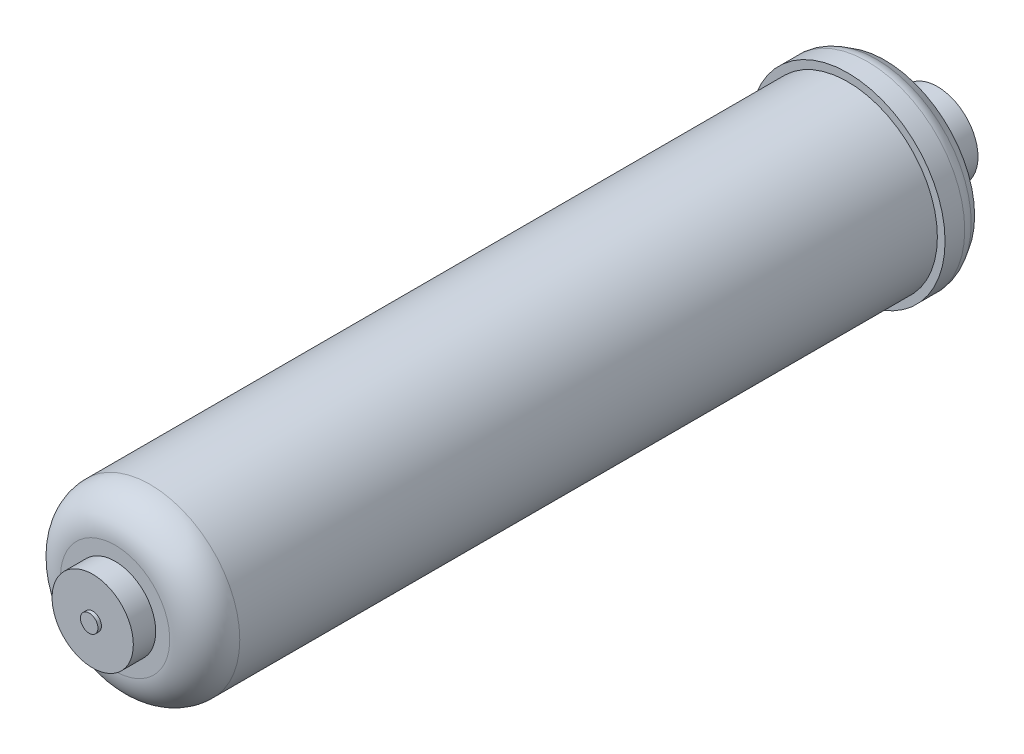
ISO-10303-21;
HEADER;
FILE_DESCRIPTION(('STEP AP214'),'2;1');
FILE_NAME('part.step','',(''),(''),'','','');
FILE_SCHEMA(('AUTOMOTIVE_DESIGN { 1 0 10303 214 1 1 1 1 }'));
ENDSEC;
DATA;
#1=APPLICATION_CONTEXT('core data for automotive mechanical design processes');
#2=APPLICATION_PROTOCOL_DEFINITION('international standard','automotive_design',2000,#1);
#3=PRODUCT_CONTEXT('',#1,'mechanical');
#4=PRODUCT('Part','Part','',(#3));
#5=PRODUCT_RELATED_PRODUCT_CATEGORY('part','',(#4));
#6=PRODUCT_DEFINITION_FORMATION('','',#4);
#7=PRODUCT_DEFINITION_CONTEXT('part definition',#1,'design');
#8=PRODUCT_DEFINITION('design','',#6,#7);
#9=PRODUCT_DEFINITION_SHAPE('','',#8);
#10=(LENGTH_UNIT() NAMED_UNIT(*) SI_UNIT(.MILLI.,.METRE.));
#11=(NAMED_UNIT(*) PLANE_ANGLE_UNIT() SI_UNIT($,.RADIAN.));
#12=(NAMED_UNIT(*) SI_UNIT($,.STERADIAN.) SOLID_ANGLE_UNIT());
#13=UNCERTAINTY_MEASURE_WITH_UNIT(LENGTH_MEASURE(1.E-05),#10,'distance_accuracy_value','');
#14=(GEOMETRIC_REPRESENTATION_CONTEXT(3) GLOBAL_UNCERTAINTY_ASSIGNED_CONTEXT((#13)) GLOBAL_UNIT_ASSIGNED_CONTEXT((#10,
#11,#12)) REPRESENTATION_CONTEXT('',''));
#15=CARTESIAN_POINT('',(0.,0.,0.));
#16=DIRECTION('',(0.,0.,1.));
#17=DIRECTION('',(1.,0.,0.));
#18=AXIS2_PLACEMENT_3D('',#15,#16,#17);
#19=CARTESIAN_POINT('',(0.,0.,0.));
#20=DIRECTION('',(0.,0.,-1.));
#21=DIRECTION('',(-1.,0.,0.));
#22=AXIS2_PLACEMENT_3D('',#19,#20,#21);
#23=PLANE('',#22);
#24=CARTESIAN_POINT('',(0.,0.,0.));
#25=DIRECTION('',(0.,0.,1.));
#26=DIRECTION('',(1.,0.,0.));
#27=AXIS2_PLACEMENT_3D('',#24,#25,#26);
#28=CIRCLE('',#27,3.175);
#29=CARTESIAN_POINT('',(3.175,0.,0.));
#30=VERTEX_POINT('',#29);
#31=EDGE_CURVE('E51',#30,#30,#28,.T.);
#32=ORIENTED_EDGE('',*,*,#31,.T.);
#33=EDGE_LOOP('',(#32));
#34=FACE_BOUND('',#33,.T.);
#35=ADVANCED_FACE('F31',(#34),#23,.F.);
#36=CARTESIAN_POINT('',(0.,0.,0.));
#37=DIRECTION('',(0.,0.,1.));
#38=DIRECTION('',(1.,0.,0.));
#39=AXIS2_PLACEMENT_3D('',#36,#37,#38);
#40=CYLINDRICAL_SURFACE('',#39,3.175);
#41=ORIENTED_EDGE('',*,*,#31,.F.);
#42=EDGE_LOOP('',(#41));
#43=FACE_BOUND('',#42,.T.);
#44=CARTESIAN_POINT('',(0.,0.,-1.27));
#45=DIRECTION('',(0.,0.,1.));
#46=DIRECTION('',(1.,0.,0.));
#47=AXIS2_PLACEMENT_3D('',#44,#45,#46);
#48=CIRCLE('',#47,3.175);
#49=CARTESIAN_POINT('',(3.175,0.,-1.27));
#50=VERTEX_POINT('',#49);
#51=EDGE_CURVE('E54',#50,#50,#48,.T.);
#52=ORIENTED_EDGE('',*,*,#51,.T.);
#53=EDGE_LOOP('',(#52));
#54=FACE_BOUND('',#53,.T.);
#55=ADVANCED_FACE('F100',(#43,#54),#40,.T.);
#56=CARTESIAN_POINT('',(0.,3.175,-1.27));
#57=DIRECTION('',(0.,0.,-1.));
#58=DIRECTION('',(-1.,0.,0.));
#59=AXIS2_PLACEMENT_3D('',#56,#57,#58);
#60=PLANE('',#59);
#61=ORIENTED_EDGE('',*,*,#51,.F.);
#62=EDGE_LOOP('',(#61));
#63=FACE_BOUND('',#62,.T.);
#64=CARTESIAN_POINT('',(0.,0.,-1.27));
#65=DIRECTION('',(0.,0.,1.));
#66=DIRECTION('',(1.,0.,0.));
#67=AXIS2_PLACEMENT_3D('',#64,#65,#66);
#68=CIRCLE('',#67,14.732);
#69=CARTESIAN_POINT('',(14.732,0.,-1.27));
#70=VERTEX_POINT('',#69);
#71=EDGE_CURVE('E57',#70,#70,#68,.T.);
#72=ORIENTED_EDGE('',*,*,#71,.T.);
#73=EDGE_LOOP('',(#72));
#74=FACE_BOUND('',#73,.T.);
#75=ADVANCED_FACE('F106',(#63,#74),#60,.F.);
#76=CARTESIAN_POINT('',(0.,0.,0.));
#77=DIRECTION('',(0.,0.,1.));
#78=DIRECTION('',(1.,0.,0.));
#79=AXIS2_PLACEMENT_3D('',#76,#77,#78);
#80=CYLINDRICAL_SURFACE('',#79,14.732);
#81=ORIENTED_EDGE('',*,*,#71,.F.);
#82=EDGE_LOOP('',(#81));
#83=FACE_BOUND('',#82,.T.);
#84=CARTESIAN_POINT('',(0.,0.,-9.398));
#85=DIRECTION('',(0.,0.,1.));
#86=DIRECTION('',(1.,0.,0.));
#87=AXIS2_PLACEMENT_3D('',#84,#85,#86);
#88=CIRCLE('',#87,14.732);
#89=CARTESIAN_POINT('',(14.732,0.,-9.398));
#90=VERTEX_POINT('',#89);
#91=EDGE_CURVE('E60',#90,#90,#88,.T.);
#92=ORIENTED_EDGE('',*,*,#91,.T.);
#93=EDGE_LOOP('',(#92));
#94=FACE_BOUND('',#93,.T.);
#95=ADVANCED_FACE('F112',(#83,#94),#80,.T.);
#96=CARTESIAN_POINT('',(0.,14.732,-9.398));
#97=DIRECTION('',(0.,0.,-1.));
#98=DIRECTION('',(-1.,0.,0.));
#99=AXIS2_PLACEMENT_3D('',#96,#97,#98);
#100=PLANE('',#99);
#101=CARTESIAN_POINT('',(0.,0.,-9.398));
#102=DIRECTION('',(0.,0.,-1.));
#103=DIRECTION('',(-1.,0.,0.));
#104=AXIS2_PLACEMENT_3D('',#101,#102,#103);
#105=CIRCLE('',#104,19.812);
#106=CARTESIAN_POINT('',(-19.812,0.,-9.398));
#107=VERTEX_POINT('',#106);
#108=EDGE_CURVE('E46',#107,#107,#105,.F.);
#109=ORIENTED_EDGE('',*,*,#108,.T.);
#110=EDGE_LOOP('',(#109));
#111=FACE_BOUND('',#110,.T.);
#112=ORIENTED_EDGE('',*,*,#91,.F.);
#113=EDGE_LOOP('',(#112));
#114=FACE_BOUND('',#113,.T.);
#115=ADVANCED_FACE('F116',(#111,#114),#100,.F.);
#116=CARTESIAN_POINT('',(0.,0.,0.));
#117=DIRECTION('',(0.,0.,1.));
#118=DIRECTION('',(1.,0.,0.));
#119=AXIS2_PLACEMENT_3D('',#116,#117,#118);
#120=CYLINDRICAL_SURFACE('',#119,32.512);
#121=CARTESIAN_POINT('',(0.,0.,-22.098));
#122=DIRECTION('',(0.,0.,-1.));
#123=DIRECTION('',(-1.,0.,0.));
#124=AXIS2_PLACEMENT_3D('',#121,#122,#123);
#125=CIRCLE('',#124,32.512);
#126=CARTESIAN_POINT('',(-32.512,0.,-22.098));
#127=VERTEX_POINT('',#126);
#128=EDGE_CURVE('E42',#127,#127,#125,.T.);
#129=ORIENTED_EDGE('',*,*,#128,.T.);
#130=EDGE_LOOP('',(#129));
#131=FACE_BOUND('',#130,.T.);
#132=CARTESIAN_POINT('',(0.,0.,-275.082));
#133=DIRECTION('',(0.,0.,1.));
#134=DIRECTION('',(1.,0.,0.));
#135=AXIS2_PLACEMENT_3D('',#132,#133,#134);
#136=CIRCLE('',#135,32.512);
#137=CARTESIAN_POINT('',(32.512,0.,-275.082));
#138=VERTEX_POINT('',#137);
#139=EDGE_CURVE('E63',#138,#138,#136,.T.);
#140=ORIENTED_EDGE('',*,*,#139,.T.);
#141=EDGE_LOOP('',(#140));
#142=FACE_BOUND('',#141,.T.);
#143=ADVANCED_FACE('F120',(#131,#142),#120,.T.);
#144=CARTESIAN_POINT('',(0.,32.512,-275.082));
#145=DIRECTION('',(0.,0.,-1.));
#146=DIRECTION('',(-1.,0.,0.));
#147=AXIS2_PLACEMENT_3D('',#144,#145,#146);
#148=PLANE('',#147);
#149=ORIENTED_EDGE('',*,*,#139,.F.);
#150=EDGE_LOOP('',(#149));
#151=FACE_BOUND('',#150,.T.);
#152=CARTESIAN_POINT('',(0.,0.,-275.082));
#153=DIRECTION('',(0.,0.,1.));
#154=DIRECTION('',(1.,0.,0.));
#155=AXIS2_PLACEMENT_3D('',#152,#153,#154);
#156=CIRCLE('',#155,35.306);
#157=CARTESIAN_POINT('',(35.306,0.,-275.082));
#158=VERTEX_POINT('',#157);
#159=EDGE_CURVE('E66',#158,#158,#156,.T.);
#160=ORIENTED_EDGE('',*,*,#159,.T.);
#161=EDGE_LOOP('',(#160));
#162=FACE_BOUND('',#161,.T.);
#163=ADVANCED_FACE('F124',(#151,#162),#148,.F.);
#164=CARTESIAN_POINT('',(0.,0.,0.));
#165=DIRECTION('',(0.,0.,1.));
#166=DIRECTION('',(1.,0.,0.));
#167=AXIS2_PLACEMENT_3D('',#164,#165,#166);
#168=CYLINDRICAL_SURFACE('',#167,35.306);
#169=CARTESIAN_POINT('',(0.,0.,-282.2089120975));
#170=DIRECTION('',(0.,0.,-1.));
#171=DIRECTION('',(-1.,0.,0.));
#172=AXIS2_PLACEMENT_3D('',#169,#170,#171);
#173=CIRCLE('',#172,35.306);
#174=CARTESIAN_POINT('',(-35.306,0.,-282.2089120975));
#175=VERTEX_POINT('',#174);
#176=EDGE_CURVE('E38',#175,#175,#173,.F.);
#177=ORIENTED_EDGE('',*,*,#176,.T.);
#178=EDGE_LOOP('',(#177));
#179=FACE_BOUND('',#178,.T.);
#180=ORIENTED_EDGE('',*,*,#159,.F.);
#181=EDGE_LOOP('',(#180));
#182=FACE_BOUND('',#181,.T.);
#183=ADVANCED_FACE('F128',(#179,#182),#168,.T.);
#184=CARTESIAN_POINT('',(0.,0.,-288.544));
#185=DIRECTION('',(0.,0.,1.));
#186=DIRECTION('',(1.,0.,0.));
#187=AXIS2_PLACEMENT_3D('',#184,#185,#186);
#188=CONICAL_SURFACE('',#187,32.5550841268207,0.541659485455934);
#189=CARTESIAN_POINT('',(0.,0.,-285.482709449718));
#190=DIRECTION('',(0.,0.,-1.));
#191=DIRECTION('',(-1.,0.,0.));
#192=AXIS2_PLACEMENT_3D('',#189,#190,#191);
#193=CIRCLE('',#192,34.3970248020577);
#194=CARTESIAN_POINT('',(-34.3970248020577,0.,-285.482709449718));
#195=VERTEX_POINT('',#194);
#196=EDGE_CURVE('E10',#195,#195,#193,.T.);
#197=ORIENTED_EDGE('',*,*,#196,.T.);
#198=EDGE_LOOP('',(#197));
#199=FACE_BOUND('',#198,.T.);
#200=CARTESIAN_POINT('',(0.,0.,-288.544));
#201=DIRECTION('',(0.,0.,1.));
#202=DIRECTION('',(1.,0.,0.));
#203=AXIS2_PLACEMENT_3D('',#200,#201,#202);
#204=CIRCLE('',#203,32.5550841268207);
#205=CARTESIAN_POINT('',(32.5550841268207,0.,-288.544));
#206=VERTEX_POINT('',#205);
#207=EDGE_CURVE('E69',#206,#206,#204,.T.);
#208=ORIENTED_EDGE('',*,*,#207,.T.);
#209=EDGE_LOOP('',(#208));
#210=FACE_BOUND('',#209,.T.);
#211=ADVANCED_FACE('F132',(#199,#210),#188,.T.);
#212=CARTESIAN_POINT('',(0.,0.,-299.466));
#213=DIRECTION('',(0.,0.,1.));
#214=DIRECTION('',(1.,0.,0.));
#215=AXIS2_PLACEMENT_3D('',#212,#213,#214);
#216=CONICAL_SURFACE('',#215,14.732,1.02101761241668);
#217=ORIENTED_EDGE('',*,*,#207,.F.);
#218=EDGE_LOOP('',(#217));
#219=FACE_BOUND('',#218,.T.);
#220=CARTESIAN_POINT('',(0.,0.,-299.466));
#221=DIRECTION('',(0.,0.,1.));
#222=DIRECTION('',(1.,0.,0.));
#223=AXIS2_PLACEMENT_3D('',#220,#221,#222);
#224=CIRCLE('',#223,14.732);
#225=CARTESIAN_POINT('',(14.732,0.,-299.466));
#226=VERTEX_POINT('',#225);
#227=EDGE_CURVE('E72',#226,#226,#224,.T.);
#228=ORIENTED_EDGE('',*,*,#227,.T.);
#229=EDGE_LOOP('',(#228));
#230=FACE_BOUND('',#229,.T.);
#231=ADVANCED_FACE('F135',(#219,#230),#216,.T.);
#232=CARTESIAN_POINT('',(0.,0.,0.));
#233=DIRECTION('',(0.,0.,1.));
#234=DIRECTION('',(1.,0.,0.));
#235=AXIS2_PLACEMENT_3D('',#232,#233,#234);
#236=CYLINDRICAL_SURFACE('',#235,14.732);
#237=ORIENTED_EDGE('',*,*,#227,.F.);
#238=EDGE_LOOP('',(#237));
#239=FACE_BOUND('',#238,.T.);
#240=CARTESIAN_POINT('',(0.,0.,-307.594));
#241=DIRECTION('',(0.,0.,1.));
#242=DIRECTION('',(1.,0.,0.));
#243=AXIS2_PLACEMENT_3D('',#240,#241,#242);
#244=CIRCLE('',#243,14.732);
#245=CARTESIAN_POINT('',(14.732,0.,-307.594));
#246=VERTEX_POINT('',#245);
#247=EDGE_CURVE('E75',#246,#246,#244,.T.);
#248=ORIENTED_EDGE('',*,*,#247,.T.);
#249=EDGE_LOOP('',(#248));
#250=FACE_BOUND('',#249,.T.);
#251=ADVANCED_FACE('F138',(#239,#250),#236,.T.);
#252=CARTESIAN_POINT('',(0.,14.732,-307.594));
#253=DIRECTION('',(0.,0.,1.));
#254=DIRECTION('',(1.,0.,0.));
#255=AXIS2_PLACEMENT_3D('',#252,#253,#254);
#256=PLANE('',#255);
#257=ORIENTED_EDGE('',*,*,#247,.F.);
#258=EDGE_LOOP('',(#257));
#259=FACE_BOUND('',#258,.T.);
#260=CARTESIAN_POINT('',(0.,0.,-307.594));
#261=DIRECTION('',(0.,0.,1.));
#262=DIRECTION('',(1.,0.,0.));
#263=AXIS2_PLACEMENT_3D('',#260,#261,#262);
#264=CIRCLE('',#263,3.175);
#265=CARTESIAN_POINT('',(3.175,0.,-307.594));
#266=VERTEX_POINT('',#265);
#267=EDGE_CURVE('E78',#266,#266,#264,.T.);
#268=ORIENTED_EDGE('',*,*,#267,.T.);
#269=EDGE_LOOP('',(#268));
#270=FACE_BOUND('',#269,.T.);
#271=ADVANCED_FACE('F96',(#259,#270),#256,.F.);
#272=CARTESIAN_POINT('',(0.,0.,0.));
#273=DIRECTION('',(0.,0.,1.));
#274=DIRECTION('',(1.,0.,0.));
#275=AXIS2_PLACEMENT_3D('',#272,#273,#274);
#276=CYLINDRICAL_SURFACE('',#275,3.175);
#277=ORIENTED_EDGE('',*,*,#267,.F.);
#278=EDGE_LOOP('',(#277));
#279=FACE_BOUND('',#278,.T.);
#280=CARTESIAN_POINT('',(0.,0.,-308.864));
#281=DIRECTION('',(0.,0.,1.));
#282=DIRECTION('',(1.,0.,0.));
#283=AXIS2_PLACEMENT_3D('',#280,#281,#282);
#284=CIRCLE('',#283,3.175);
#285=CARTESIAN_POINT('',(3.175,0.,-308.864));
#286=VERTEX_POINT('',#285);
#287=EDGE_CURVE('E81',#286,#286,#284,.T.);
#288=ORIENTED_EDGE('',*,*,#287,.T.);
#289=EDGE_LOOP('',(#288));
#290=FACE_BOUND('',#289,.T.);
#291=ADVANCED_FACE('F85',(#279,#290),#276,.T.);
#292=CARTESIAN_POINT('',(0.,3.175,-308.864));
#293=DIRECTION('',(0.,0.,1.));
#294=DIRECTION('',(1.,0.,0.));
#295=AXIS2_PLACEMENT_3D('',#292,#293,#294);
#296=PLANE('',#295);
#297=ORIENTED_EDGE('',*,*,#287,.F.);
#298=EDGE_LOOP('',(#297));
#299=FACE_BOUND('',#298,.T.);
#300=ADVANCED_FACE('F87',(#299),#296,.F.);
#301=CARTESIAN_POINT('',(0.,0.,-22.098));
#302=DIRECTION('',(0.,0.,-1.));
#303=DIRECTION('',(-1.,0.,0.));
#304=AXIS2_PLACEMENT_3D('',#301,#302,#303);
#305=TOROIDAL_SURFACE('',#304,19.812,12.7);
#306=ORIENTED_EDGE('',*,*,#128,.F.);
#307=EDGE_LOOP('',(#306));
#308=FACE_BOUND('',#307,.T.);
#309=ORIENTED_EDGE('',*,*,#108,.F.);
#310=EDGE_LOOP('',(#309));
#311=FACE_BOUND('',#310,.T.);
#312=ADVANCED_FACE('F89',(#308,#311),#305,.T.);
#313=CARTESIAN_POINT('',(0.,0.,-282.2089120975));
#314=DIRECTION('',(0.,0.,-1.));
#315=DIRECTION('',(-1.,0.,0.));
#316=AXIS2_PLACEMENT_3D('',#313,#314,#315);
#317=TOROIDAL_SURFACE('',#316,28.956,6.35);
#318=ORIENTED_EDGE('',*,*,#196,.F.);
#319=EDGE_LOOP('',(#318));
#320=FACE_BOUND('',#319,.T.);
#321=ORIENTED_EDGE('',*,*,#176,.F.);
#322=EDGE_LOOP('',(#321));
#323=FACE_BOUND('',#322,.T.);
#324=ADVANCED_FACE('F33',(#320,#323),#317,.T.);
#325=CLOSED_SHELL('',(#35,#55,#75,#95,#115,#143,#163,#183,#211,#231,#251,#271,#291,#300,#312,#324));
#326=MANIFOLD_SOLID_BREP('B2',#325);
#327=ADVANCED_BREP_SHAPE_REPRESENTATION('',(#18,#326),#14);
#328=SHAPE_DEFINITION_REPRESENTATION(#9,#327);
ENDSEC;
END-ISO-10303-21;
